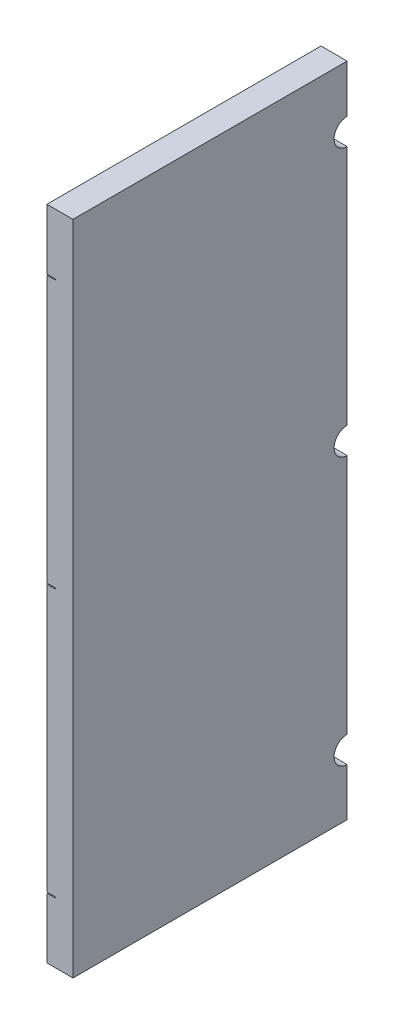
ISO-10303-21;
HEADER;
FILE_DESCRIPTION(('STEP AP214'),'2;1');
FILE_NAME('part.step','',(''),(''),'','','');
FILE_SCHEMA(('AUTOMOTIVE_DESIGN { 1 0 10303 214 1 1 1 1 }'));
ENDSEC;
DATA;
#1=APPLICATION_CONTEXT('core data for automotive mechanical design processes');
#2=APPLICATION_PROTOCOL_DEFINITION('international standard','automotive_design',2000,#1);
#3=PRODUCT_CONTEXT('',#1,'mechanical');
#4=PRODUCT('Part','Part','',(#3));
#5=PRODUCT_RELATED_PRODUCT_CATEGORY('part','',(#4));
#6=PRODUCT_DEFINITION_FORMATION('','',#4);
#7=PRODUCT_DEFINITION_CONTEXT('part definition',#1,'design');
#8=PRODUCT_DEFINITION('design','',#6,#7);
#9=PRODUCT_DEFINITION_SHAPE('','',#8);
#10=(LENGTH_UNIT() NAMED_UNIT(*) SI_UNIT(.MILLI.,.METRE.));
#11=(NAMED_UNIT(*) PLANE_ANGLE_UNIT() SI_UNIT($,.RADIAN.));
#12=(NAMED_UNIT(*) SI_UNIT($,.STERADIAN.) SOLID_ANGLE_UNIT());
#13=UNCERTAINTY_MEASURE_WITH_UNIT(LENGTH_MEASURE(1.E-05),#10,'distance_accuracy_value','');
#14=(GEOMETRIC_REPRESENTATION_CONTEXT(3) GLOBAL_UNCERTAINTY_ASSIGNED_CONTEXT((#13)) GLOBAL_UNIT_ASSIGNED_CONTEXT((#10,
#11,#12)) REPRESENTATION_CONTEXT('',''));
#15=CARTESIAN_POINT('',(0.,0.,0.));
#16=DIRECTION('',(0.,0.,1.));
#17=DIRECTION('',(1.,0.,0.));
#18=AXIS2_PLACEMENT_3D('',#15,#16,#17);
#19=CARTESIAN_POINT('',(0.,0.,0.));
#20=DIRECTION('',(0.,0.,-1.));
#21=DIRECTION('',(-1.,0.,0.));
#22=AXIS2_PLACEMENT_3D('',#19,#20,#21);
#23=PLANE('',#22);
#24=DIRECTION('',(-1.,0.,0.));
#25=VECTOR('',#24,1.);
#26=CARTESIAN_POINT('',(4.,5.5,0.));
#27=LINE('',#26,#25);
#28=CARTESIAN_POINT('',(3.,5.5,0.));
#29=VERTEX_POINT('',#28);
#30=CARTESIAN_POINT('',(0.,5.5,0.));
#31=VERTEX_POINT('',#30);
#32=EDGE_CURVE('E11',#29,#31,#27,.T.);
#33=ORIENTED_EDGE('',*,*,#32,.F.);
#34=DIRECTION('',(0.,1.,0.));
#35=VECTOR('',#34,1.);
#36=CARTESIAN_POINT('',(3.,0.,0.));
#37=LINE('',#36,#35);
#38=CARTESIAN_POINT('',(3.,0.,0.));
#39=VERTEX_POINT('',#38);
#40=EDGE_CURVE('E207',#39,#29,#37,.T.);
#41=ORIENTED_EDGE('',*,*,#40,.F.);
#42=DIRECTION('',(1.,0.,0.));
#43=VECTOR('',#42,1.);
#44=CARTESIAN_POINT('',(0.,0.,0.));
#45=LINE('',#44,#43);
#46=CARTESIAN_POINT('',(0.,0.,0.));
#47=VERTEX_POINT('',#46);
#48=EDGE_CURVE('E167',#47,#39,#45,.T.);
#49=ORIENTED_EDGE('',*,*,#48,.F.);
#50=DIRECTION('',(0.,-1.,0.));
#51=VECTOR('',#50,1.);
#52=CARTESIAN_POINT('',(0.,0.,0.));
#53=LINE('',#52,#51);
#54=EDGE_CURVE('E161',#31,#47,#53,.T.);
#55=ORIENTED_EDGE('',*,*,#54,.F.);
#56=EDGE_LOOP('',(#33,#41,#49,#55));
#57=FACE_BOUND('',#56,.T.);
#58=ADVANCED_FACE('F41',(#57),#23,.T.);
#59=DIRECTION('',(-1.,0.,0.));
#60=VECTOR('',#59,1.);
#61=CARTESIAN_POINT('',(4.,8.5,0.));
#62=LINE('',#61,#60);
#63=CARTESIAN_POINT('',(0.,8.5,0.));
#64=VERTEX_POINT('',#63);
#65=CARTESIAN_POINT('',(3.,8.5,0.));
#66=VERTEX_POINT('',#65);
#67=EDGE_CURVE('E49',#64,#66,#62,.F.);
#68=ORIENTED_EDGE('',*,*,#67,.F.);
#69=CARTESIAN_POINT('',(0.,36.25,0.));
#70=VERTEX_POINT('',#69);
#71=EDGE_CURVE('E164',#70,#64,#53,.T.);
#72=ORIENTED_EDGE('',*,*,#71,.F.);
#73=DIRECTION('',(-1.,0.,0.));
#74=VECTOR('',#73,1.);
#75=CARTESIAN_POINT('',(4.,36.25,0.));
#76=LINE('',#75,#74);
#77=CARTESIAN_POINT('',(3.,36.25,0.));
#78=VERTEX_POINT('',#77);
#79=EDGE_CURVE('E194',#78,#70,#76,.T.);
#80=ORIENTED_EDGE('',*,*,#79,.F.);
#81=EDGE_CURVE('E205',#66,#78,#37,.T.);
#82=ORIENTED_EDGE('',*,*,#81,.F.);
#83=EDGE_LOOP('',(#68,#72,#80,#82));
#84=FACE_BOUND('',#83,.T.);
#85=ADVANCED_FACE('F212',(#84),#23,.T.);
#86=DIRECTION('',(-1.,0.,0.));
#87=VECTOR('',#86,1.);
#88=CARTESIAN_POINT('',(4.,39.25,0.));
#89=LINE('',#88,#87);
#90=CARTESIAN_POINT('',(0.,39.25,0.));
#91=VERTEX_POINT('',#90);
#92=CARTESIAN_POINT('',(3.,39.25,0.));
#93=VERTEX_POINT('',#92);
#94=EDGE_CURVE('E191',#91,#93,#89,.F.);
#95=ORIENTED_EDGE('',*,*,#94,.F.);
#96=CARTESIAN_POINT('',(0.,67.,0.));
#97=VERTEX_POINT('',#96);
#98=EDGE_CURVE('E172',#97,#91,#53,.T.);
#99=ORIENTED_EDGE('',*,*,#98,.F.);
#100=DIRECTION('',(-1.,0.,0.));
#101=VECTOR('',#100,1.);
#102=CARTESIAN_POINT('',(4.,67.,0.));
#103=LINE('',#102,#101);
#104=CARTESIAN_POINT('',(3.,67.,0.));
#105=VERTEX_POINT('',#104);
#106=EDGE_CURVE('E189',#105,#97,#103,.T.);
#107=ORIENTED_EDGE('',*,*,#106,.F.);
#108=EDGE_CURVE('E192',#93,#105,#37,.T.);
#109=ORIENTED_EDGE('',*,*,#108,.F.);
#110=EDGE_LOOP('',(#95,#99,#107,#109));
#111=FACE_BOUND('',#110,.T.);
#112=ADVANCED_FACE('F187',(#111),#23,.T.);
#113=CARTESIAN_POINT('',(0.,0.,31.5));
#114=DIRECTION('',(1.,0.,0.));
#115=DIRECTION('',(0.,0.,-1.));
#116=AXIS2_PLACEMENT_3D('',#113,#114,#115);
#117=PLANE('',#116);
#118=ORIENTED_EDGE('',*,*,#71,.T.);
#119=CARTESIAN_POINT('',(0.,7.,0.));
#120=DIRECTION('',(-1.,0.,0.));
#121=DIRECTION('',(0.,0.,1.));
#122=AXIS2_PLACEMENT_3D('',#119,#120,#121);
#123=CIRCLE('',#122,1.5);
#124=EDGE_CURVE('E55',#31,#64,#123,.T.);
#125=ORIENTED_EDGE('',*,*,#124,.F.);
#126=ORIENTED_EDGE('',*,*,#54,.T.);
#127=DIRECTION('',(0.,0.,-1.));
#128=VECTOR('',#127,1.);
#129=CARTESIAN_POINT('',(0.,0.,31.5));
#130=LINE('',#129,#128);
#131=CARTESIAN_POINT('',(0.,0.,31.5));
#132=VERTEX_POINT('',#131);
#133=EDGE_CURVE('E218',#132,#47,#130,.T.);
#134=ORIENTED_EDGE('',*,*,#133,.F.);
#135=DIRECTION('',(0.,-1.,0.));
#136=VECTOR('',#135,1.);
#137=CARTESIAN_POINT('',(0.,0.,31.5));
#138=LINE('',#137,#136);
#139=CARTESIAN_POINT('',(0.,6.94523687371953,31.5));
#140=VERTEX_POINT('',#139);
#141=EDGE_CURVE('E214',#140,#132,#138,.T.);
#142=ORIENTED_EDGE('',*,*,#141,.F.);
#143=CARTESIAN_POINT('',(0.,7.,30.001));
#144=DIRECTION('',(-1.,0.,0.));
#145=DIRECTION('',(0.,0.,1.));
#146=AXIS2_PLACEMENT_3D('',#143,#144,#145);
#147=CIRCLE('',#146,1.5);
#148=CARTESIAN_POINT('',(0.,7.05476312628047,31.5));
#149=VERTEX_POINT('',#148);
#150=EDGE_CURVE('E290',#149,#140,#147,.T.);
#151=ORIENTED_EDGE('',*,*,#150,.F.);
#152=CARTESIAN_POINT('',(0.,37.6952368737195,31.5));
#153=VERTEX_POINT('',#152);
#154=EDGE_CURVE('E250',#153,#149,#138,.T.);
#155=ORIENTED_EDGE('',*,*,#154,.F.);
#156=CARTESIAN_POINT('',(0.,37.75,30.001));
#157=DIRECTION('',(-1.,0.,0.));
#158=DIRECTION('',(0.,0.,1.));
#159=AXIS2_PLACEMENT_3D('',#156,#157,#158);
#160=CIRCLE('',#159,1.5);
#161=CARTESIAN_POINT('',(0.,37.8047631262805,31.5));
#162=VERTEX_POINT('',#161);
#163=EDGE_CURVE('E312',#162,#153,#160,.T.);
#164=ORIENTED_EDGE('',*,*,#163,.F.);
#165=CARTESIAN_POINT('',(0.,68.4452368737195,31.5));
#166=VERTEX_POINT('',#165);
#167=EDGE_CURVE('E239',#166,#162,#138,.T.);
#168=ORIENTED_EDGE('',*,*,#167,.F.);
#169=CARTESIAN_POINT('',(0.,68.5,30.001));
#170=DIRECTION('',(-1.,0.,0.));
#171=DIRECTION('',(0.,0.,1.));
#172=AXIS2_PLACEMENT_3D('',#169,#170,#171);
#173=CIRCLE('',#172,1.5);
#174=CARTESIAN_POINT('',(0.,68.5547631262805,31.5));
#175=VERTEX_POINT('',#174);
#176=EDGE_CURVE('E321',#175,#166,#173,.T.);
#177=ORIENTED_EDGE('',*,*,#176,.F.);
#178=CARTESIAN_POINT('',(0.,75.5,31.5));
#179=VERTEX_POINT('',#178);
#180=EDGE_CURVE('E234',#179,#175,#138,.T.);
#181=ORIENTED_EDGE('',*,*,#180,.F.);
#182=DIRECTION('',(0.,0.,-1.));
#183=VECTOR('',#182,1.);
#184=CARTESIAN_POINT('',(0.,75.5,31.5));
#185=LINE('',#184,#183);
#186=CARTESIAN_POINT('',(0.,75.5,0.));
#187=VERTEX_POINT('',#186);
#188=EDGE_CURVE('E174',#179,#187,#185,.T.);
#189=ORIENTED_EDGE('',*,*,#188,.T.);
#190=CARTESIAN_POINT('',(0.,70.,0.));
#191=VERTEX_POINT('',#190);
#192=EDGE_CURVE('E171',#187,#191,#53,.T.);
#193=ORIENTED_EDGE('',*,*,#192,.T.);
#194=CARTESIAN_POINT('',(0.,68.5,0.));
#195=DIRECTION('',(-1.,0.,0.));
#196=DIRECTION('',(0.,0.,1.));
#197=AXIS2_PLACEMENT_3D('',#194,#195,#196);
#198=CIRCLE('',#197,1.5);
#199=EDGE_CURVE('E184',#97,#191,#198,.T.);
#200=ORIENTED_EDGE('',*,*,#199,.F.);
#201=ORIENTED_EDGE('',*,*,#98,.T.);
#202=CARTESIAN_POINT('',(0.,37.75,0.));
#203=DIRECTION('',(-1.,0.,0.));
#204=DIRECTION('',(0.,0.,1.));
#205=AXIS2_PLACEMENT_3D('',#202,#203,#204);
#206=CIRCLE('',#205,1.5);
#207=EDGE_CURVE('E63',#70,#91,#206,.T.);
#208=ORIENTED_EDGE('',*,*,#207,.F.);
#209=EDGE_LOOP('',(#118,#125,#126,#134,#142,#151,#155,#164,#168,#177,#181,#189,#193,#200,#201,#208));
#210=FACE_BOUND('',#209,.T.);
#211=ADVANCED_FACE('F43',(#210),#117,.F.);
#212=CARTESIAN_POINT('',(0.,0.,31.5));
#213=DIRECTION('',(0.,1.,0.));
#214=DIRECTION('',(0.,0.,1.));
#215=AXIS2_PLACEMENT_3D('',#212,#213,#214);
#216=PLANE('',#215);
#217=ORIENTED_EDGE('',*,*,#48,.T.);
#218=DIRECTION('',(0.,0.,-1.));
#219=VECTOR('',#218,1.);
#220=CARTESIAN_POINT('',(3.,0.,31.5));
#221=LINE('',#220,#219);
#222=CARTESIAN_POINT('',(3.,0.,31.5));
#223=VERTEX_POINT('',#222);
#224=EDGE_CURVE('E216',#223,#39,#221,.T.);
#225=ORIENTED_EDGE('',*,*,#224,.F.);
#226=DIRECTION('',(1.,0.,0.));
#227=VECTOR('',#226,1.);
#228=CARTESIAN_POINT('',(0.,0.,31.5));
#229=LINE('',#228,#227);
#230=EDGE_CURVE('E238',#132,#223,#229,.T.);
#231=ORIENTED_EDGE('',*,*,#230,.F.);
#232=ORIENTED_EDGE('',*,*,#133,.T.);
#233=EDGE_LOOP('',(#217,#225,#231,#232));
#234=FACE_BOUND('',#233,.T.);
#235=ADVANCED_FACE('F292',(#234),#216,.F.);
#236=CARTESIAN_POINT('',(3.,0.,31.5));
#237=DIRECTION('',(-1.,0.,0.));
#238=DIRECTION('',(0.,0.,1.));
#239=AXIS2_PLACEMENT_3D('',#236,#237,#238);
#240=PLANE('',#239);
#241=ORIENTED_EDGE('',*,*,#40,.T.);
#242=CARTESIAN_POINT('',(3.,7.,0.));
#243=DIRECTION('',(-1.,0.,0.));
#244=DIRECTION('',(0.,0.,1.));
#245=AXIS2_PLACEMENT_3D('',#242,#243,#244);
#246=CIRCLE('',#245,1.5);
#247=EDGE_CURVE('E153',#29,#66,#246,.T.);
#248=ORIENTED_EDGE('',*,*,#247,.T.);
#249=ORIENTED_EDGE('',*,*,#81,.T.);
#250=CARTESIAN_POINT('',(3.,37.75,0.));
#251=DIRECTION('',(-1.,0.,0.));
#252=DIRECTION('',(0.,0.,1.));
#253=AXIS2_PLACEMENT_3D('',#250,#251,#252);
#254=CIRCLE('',#253,1.5);
#255=EDGE_CURVE('E209',#78,#93,#254,.T.);
#256=ORIENTED_EDGE('',*,*,#255,.T.);
#257=ORIENTED_EDGE('',*,*,#108,.T.);
#258=CARTESIAN_POINT('',(3.,68.5,0.));
#259=DIRECTION('',(-1.,0.,0.));
#260=DIRECTION('',(0.,0.,1.));
#261=AXIS2_PLACEMENT_3D('',#258,#259,#260);
#262=CIRCLE('',#261,1.5);
#263=CARTESIAN_POINT('',(3.,70.,0.));
#264=VERTEX_POINT('',#263);
#265=EDGE_CURVE('E165',#105,#264,#262,.T.);
#266=ORIENTED_EDGE('',*,*,#265,.T.);
#267=CARTESIAN_POINT('',(3.,75.5,0.));
#268=VERTEX_POINT('',#267);
#269=EDGE_CURVE('E181',#264,#268,#37,.T.);
#270=ORIENTED_EDGE('',*,*,#269,.T.);
#271=DIRECTION('',(0.,0.,-1.));
#272=VECTOR('',#271,1.);
#273=CARTESIAN_POINT('',(3.,75.5,31.5));
#274=LINE('',#273,#272);
#275=CARTESIAN_POINT('',(3.,75.5,31.5));
#276=VERTEX_POINT('',#275);
#277=EDGE_CURVE('E169',#276,#268,#274,.T.);
#278=ORIENTED_EDGE('',*,*,#277,.F.);
#279=DIRECTION('',(0.,1.,0.));
#280=VECTOR('',#279,1.);
#281=CARTESIAN_POINT('',(3.,0.,31.5));
#282=LINE('',#281,#280);
#283=EDGE_CURVE('E219',#223,#276,#282,.T.);
#284=ORIENTED_EDGE('',*,*,#283,.F.);
#285=ORIENTED_EDGE('',*,*,#224,.T.);
#286=EDGE_LOOP('',(#241,#248,#249,#256,#257,#266,#270,#278,#284,#285));
#287=FACE_BOUND('',#286,.T.);
#288=ADVANCED_FACE('F204',(#287),#240,.F.);
#289=CARTESIAN_POINT('',(0.,0.,31.5));
#290=DIRECTION('',(0.,0.,-1.));
#291=DIRECTION('',(-1.,0.,0.));
#292=AXIS2_PLACEMENT_3D('',#289,#290,#291);
#293=PLANE('',#292);
#294=DIRECTION('',(0.,1.,0.));
#295=VECTOR('',#294,1.);
#296=CARTESIAN_POINT('',(1.,7.,31.5));
#297=LINE('',#296,#295);
#298=CARTESIAN_POINT('',(1.,6.94523687371953,31.5));
#299=VERTEX_POINT('',#298);
#300=CARTESIAN_POINT('',(1.,7.05476312628047,31.5));
#301=VERTEX_POINT('',#300);
#302=EDGE_CURVE('E260',#299,#301,#297,.T.);
#303=ORIENTED_EDGE('',*,*,#302,.F.);
#304=DIRECTION('',(-1.,0.,0.));
#305=VECTOR('',#304,1.);
#306=CARTESIAN_POINT('',(1.,6.94523687371953,31.5));
#307=LINE('',#306,#305);
#308=EDGE_CURVE('E259',#299,#140,#307,.T.);
#309=ORIENTED_EDGE('',*,*,#308,.T.);
#310=ORIENTED_EDGE('',*,*,#141,.T.);
#311=ORIENTED_EDGE('',*,*,#230,.T.);
#312=ORIENTED_EDGE('',*,*,#283,.T.);
#313=DIRECTION('',(-1.,0.,0.));
#314=VECTOR('',#313,1.);
#315=CARTESIAN_POINT('',(0.,75.5,31.5));
#316=LINE('',#315,#314);
#317=EDGE_CURVE('E298',#276,#179,#316,.T.);
#318=ORIENTED_EDGE('',*,*,#317,.T.);
#319=ORIENTED_EDGE('',*,*,#180,.T.);
#320=DIRECTION('',(-1.,0.,0.));
#321=VECTOR('',#320,1.);
#322=CARTESIAN_POINT('',(1.,68.5547631262805,31.5));
#323=LINE('',#322,#321);
#324=CARTESIAN_POINT('',(1.,68.5547631262805,31.5));
#325=VERTEX_POINT('',#324);
#326=EDGE_CURVE('E227',#175,#325,#323,.F.);
#327=ORIENTED_EDGE('',*,*,#326,.T.);
#328=DIRECTION('',(0.,1.,0.));
#329=VECTOR('',#328,1.);
#330=CARTESIAN_POINT('',(1.,68.5,31.5));
#331=LINE('',#330,#329);
#332=CARTESIAN_POINT('',(1.,68.4452368737195,31.5));
#333=VERTEX_POINT('',#332);
#334=EDGE_CURVE('E221',#333,#325,#331,.T.);
#335=ORIENTED_EDGE('',*,*,#334,.F.);
#336=DIRECTION('',(-1.,0.,0.));
#337=VECTOR('',#336,1.);
#338=CARTESIAN_POINT('',(1.,68.4452368737195,31.5));
#339=LINE('',#338,#337);
#340=EDGE_CURVE('E231',#333,#166,#339,.T.);
#341=ORIENTED_EDGE('',*,*,#340,.T.);
#342=ORIENTED_EDGE('',*,*,#167,.T.);
#343=DIRECTION('',(-1.,0.,0.));
#344=VECTOR('',#343,1.);
#345=CARTESIAN_POINT('',(1.,37.8047631262805,31.5));
#346=LINE('',#345,#344);
#347=CARTESIAN_POINT('',(1.,37.8047631262805,31.5));
#348=VERTEX_POINT('',#347);
#349=EDGE_CURVE('E264',#162,#348,#346,.F.);
#350=ORIENTED_EDGE('',*,*,#349,.T.);
#351=DIRECTION('',(0.,1.,0.));
#352=VECTOR('',#351,1.);
#353=CARTESIAN_POINT('',(1.,37.75,31.5));
#354=LINE('',#353,#352);
#355=CARTESIAN_POINT('',(1.,37.6952368737195,31.5));
#356=VERTEX_POINT('',#355);
#357=EDGE_CURVE('E266',#356,#348,#354,.T.);
#358=ORIENTED_EDGE('',*,*,#357,.F.);
#359=DIRECTION('',(-1.,0.,0.));
#360=VECTOR('',#359,1.);
#361=CARTESIAN_POINT('',(1.,37.6952368737195,31.5));
#362=LINE('',#361,#360);
#363=EDGE_CURVE('E254',#356,#153,#362,.T.);
#364=ORIENTED_EDGE('',*,*,#363,.T.);
#365=ORIENTED_EDGE('',*,*,#154,.T.);
#366=DIRECTION('',(-1.,0.,0.));
#367=VECTOR('',#366,1.);
#368=CARTESIAN_POINT('',(1.,7.05476312628047,31.5));
#369=LINE('',#368,#367);
#370=EDGE_CURVE('E256',#149,#301,#369,.F.);
#371=ORIENTED_EDGE('',*,*,#370,.T.);
#372=EDGE_LOOP('',(#303,#309,#310,#311,#312,#318,#319,#327,#335,#341,#342,#350,#358,#364,#365,#371));
#373=FACE_BOUND('',#372,.T.);
#374=ADVANCED_FACE('F284',(#373),#293,.F.);
#375=DIRECTION('',(-1.,0.,0.));
#376=VECTOR('',#375,1.);
#377=CARTESIAN_POINT('',(4.,70.,0.));
#378=LINE('',#377,#376);
#379=EDGE_CURVE('E197',#191,#264,#378,.F.);
#380=ORIENTED_EDGE('',*,*,#379,.F.);
#381=ORIENTED_EDGE('',*,*,#192,.F.);
#382=DIRECTION('',(-1.,0.,0.));
#383=VECTOR('',#382,1.);
#384=CARTESIAN_POINT('',(0.,75.5,0.));
#385=LINE('',#384,#383);
#386=EDGE_CURVE('E305',#268,#187,#385,.T.);
#387=ORIENTED_EDGE('',*,*,#386,.F.);
#388=ORIENTED_EDGE('',*,*,#269,.F.);
#389=EDGE_LOOP('',(#380,#381,#387,#388));
#390=FACE_BOUND('',#389,.T.);
#391=ADVANCED_FACE('F353',(#390),#23,.T.);
#392=CARTESIAN_POINT('',(0.,75.5,31.5));
#393=DIRECTION('',(0.,-1.,0.));
#394=DIRECTION('',(0.,0.,-1.));
#395=AXIS2_PLACEMENT_3D('',#392,#393,#394);
#396=PLANE('',#395);
#397=ORIENTED_EDGE('',*,*,#386,.T.);
#398=ORIENTED_EDGE('',*,*,#188,.F.);
#399=ORIENTED_EDGE('',*,*,#317,.F.);
#400=ORIENTED_EDGE('',*,*,#277,.T.);
#401=EDGE_LOOP('',(#397,#398,#399,#400));
#402=FACE_BOUND('',#401,.T.);
#403=ADVANCED_FACE('F304',(#402),#396,.F.);
#404=CARTESIAN_POINT('',(1.,68.5,30.001));
#405=DIRECTION('',(-1.,0.,0.));
#406=DIRECTION('',(0.,0.,1.));
#407=AXIS2_PLACEMENT_3D('',#404,#405,#406);
#408=CYLINDRICAL_SURFACE('',#407,1.5);
#409=CARTESIAN_POINT('',(1.,68.5,30.001));
#410=DIRECTION('',(-1.,0.,0.));
#411=DIRECTION('',(0.,0.,1.));
#412=AXIS2_PLACEMENT_3D('',#409,#410,#411);
#413=CIRCLE('',#412,1.5);
#414=EDGE_CURVE('E208',#325,#333,#413,.T.);
#415=ORIENTED_EDGE('',*,*,#414,.F.);
#416=ORIENTED_EDGE('',*,*,#326,.F.);
#417=ORIENTED_EDGE('',*,*,#176,.T.);
#418=ORIENTED_EDGE('',*,*,#340,.F.);
#419=EDGE_LOOP('',(#415,#416,#417,#418));
#420=FACE_BOUND('',#419,.T.);
#421=ADVANCED_FACE('F331',(#420),#408,.F.);
#422=CARTESIAN_POINT('',(1.,68.5,30.001));
#423=DIRECTION('',(-1.,0.,0.));
#424=DIRECTION('',(0.,0.,1.));
#425=AXIS2_PLACEMENT_3D('',#422,#423,#424);
#426=PLANE('',#425);
#427=ORIENTED_EDGE('',*,*,#334,.T.);
#428=ORIENTED_EDGE('',*,*,#414,.T.);
#429=EDGE_LOOP('',(#427,#428));
#430=FACE_BOUND('',#429,.T.);
#431=ADVANCED_FACE('F329',(#430),#426,.T.);
#432=CARTESIAN_POINT('',(1.,37.75,30.001));
#433=DIRECTION('',(-1.,0.,0.));
#434=DIRECTION('',(0.,0.,1.));
#435=AXIS2_PLACEMENT_3D('',#432,#433,#434);
#436=CYLINDRICAL_SURFACE('',#435,1.5);
#437=CARTESIAN_POINT('',(1.,37.75,30.001));
#438=DIRECTION('',(-1.,0.,0.));
#439=DIRECTION('',(0.,0.,1.));
#440=AXIS2_PLACEMENT_3D('',#437,#438,#439);
#441=CIRCLE('',#440,1.5);
#442=EDGE_CURVE('E319',#348,#356,#441,.T.);
#443=ORIENTED_EDGE('',*,*,#442,.F.);
#444=ORIENTED_EDGE('',*,*,#349,.F.);
#445=ORIENTED_EDGE('',*,*,#163,.T.);
#446=ORIENTED_EDGE('',*,*,#363,.F.);
#447=EDGE_LOOP('',(#443,#444,#445,#446));
#448=FACE_BOUND('',#447,.T.);
#449=ADVANCED_FACE('F336',(#448),#436,.F.);
#450=CARTESIAN_POINT('',(1.,37.75,30.001));
#451=DIRECTION('',(-1.,0.,0.));
#452=DIRECTION('',(0.,0.,1.));
#453=AXIS2_PLACEMENT_3D('',#450,#451,#452);
#454=PLANE('',#453);
#455=ORIENTED_EDGE('',*,*,#357,.T.);
#456=ORIENTED_EDGE('',*,*,#442,.T.);
#457=EDGE_LOOP('',(#455,#456));
#458=FACE_BOUND('',#457,.T.);
#459=ADVANCED_FACE('F350',(#458),#454,.T.);
#460=CARTESIAN_POINT('',(1.,7.,30.001));
#461=DIRECTION('',(-1.,0.,0.));
#462=DIRECTION('',(0.,0.,1.));
#463=AXIS2_PLACEMENT_3D('',#460,#461,#462);
#464=CYLINDRICAL_SURFACE('',#463,1.5);
#465=CARTESIAN_POINT('',(1.,7.,30.001));
#466=DIRECTION('',(-1.,0.,0.));
#467=DIRECTION('',(0.,0.,1.));
#468=AXIS2_PLACEMENT_3D('',#465,#466,#467);
#469=CIRCLE('',#468,1.5);
#470=EDGE_CURVE('E307',#301,#299,#469,.T.);
#471=ORIENTED_EDGE('',*,*,#470,.F.);
#472=ORIENTED_EDGE('',*,*,#370,.F.);
#473=ORIENTED_EDGE('',*,*,#150,.T.);
#474=ORIENTED_EDGE('',*,*,#308,.F.);
#475=EDGE_LOOP('',(#471,#472,#473,#474));
#476=FACE_BOUND('',#475,.T.);
#477=ADVANCED_FACE('F337',(#476),#464,.F.);
#478=CARTESIAN_POINT('',(1.,7.,30.001));
#479=DIRECTION('',(-1.,0.,0.));
#480=DIRECTION('',(0.,0.,1.));
#481=AXIS2_PLACEMENT_3D('',#478,#479,#480);
#482=PLANE('',#481);
#483=ORIENTED_EDGE('',*,*,#302,.T.);
#484=ORIENTED_EDGE('',*,*,#470,.T.);
#485=EDGE_LOOP('',(#483,#484));
#486=FACE_BOUND('',#485,.T.);
#487=ADVANCED_FACE('F339',(#486),#482,.T.);
#488=CARTESIAN_POINT('',(4.,68.5,0.));
#489=DIRECTION('',(-1.,0.,0.));
#490=DIRECTION('',(0.,0.,1.));
#491=AXIS2_PLACEMENT_3D('',#488,#489,#490);
#492=CYLINDRICAL_SURFACE('',#491,1.5);
#493=ORIENTED_EDGE('',*,*,#106,.T.);
#494=ORIENTED_EDGE('',*,*,#199,.T.);
#495=ORIENTED_EDGE('',*,*,#379,.T.);
#496=ORIENTED_EDGE('',*,*,#265,.F.);
#497=EDGE_LOOP('',(#493,#494,#495,#496));
#498=FACE_BOUND('',#497,.T.);
#499=ADVANCED_FACE('F341',(#498),#492,.F.);
#500=CARTESIAN_POINT('',(4.,37.75,0.));
#501=DIRECTION('',(-1.,0.,0.));
#502=DIRECTION('',(0.,0.,1.));
#503=AXIS2_PLACEMENT_3D('',#500,#501,#502);
#504=CYLINDRICAL_SURFACE('',#503,1.5);
#505=ORIENTED_EDGE('',*,*,#79,.T.);
#506=ORIENTED_EDGE('',*,*,#207,.T.);
#507=ORIENTED_EDGE('',*,*,#94,.T.);
#508=ORIENTED_EDGE('',*,*,#255,.F.);
#509=EDGE_LOOP('',(#505,#506,#507,#508));
#510=FACE_BOUND('',#509,.T.);
#511=ADVANCED_FACE('F348',(#510),#504,.F.);
#512=CARTESIAN_POINT('',(4.,7.,0.));
#513=DIRECTION('',(-1.,0.,0.));
#514=DIRECTION('',(0.,0.,1.));
#515=AXIS2_PLACEMENT_3D('',#512,#513,#514);
#516=CYLINDRICAL_SURFACE('',#515,1.5);
#517=ORIENTED_EDGE('',*,*,#32,.T.);
#518=ORIENTED_EDGE('',*,*,#124,.T.);
#519=ORIENTED_EDGE('',*,*,#67,.T.);
#520=ORIENTED_EDGE('',*,*,#247,.F.);
#521=EDGE_LOOP('',(#517,#518,#519,#520));
#522=FACE_BOUND('',#521,.T.);
#523=ADVANCED_FACE('F151',(#522),#516,.F.);
#524=CLOSED_SHELL('',(#58,#85,#112,#211,#235,#288,#374,#391,#403,#421,#431,#449,#459,#477,#487,
#499,#511,#523));
#525=MANIFOLD_SOLID_BREP('B2',#524);
#526=ADVANCED_BREP_SHAPE_REPRESENTATION('',(#18,#525),#14);
#527=SHAPE_DEFINITION_REPRESENTATION(#9,#526);
ENDSEC;
END-ISO-10303-21;
